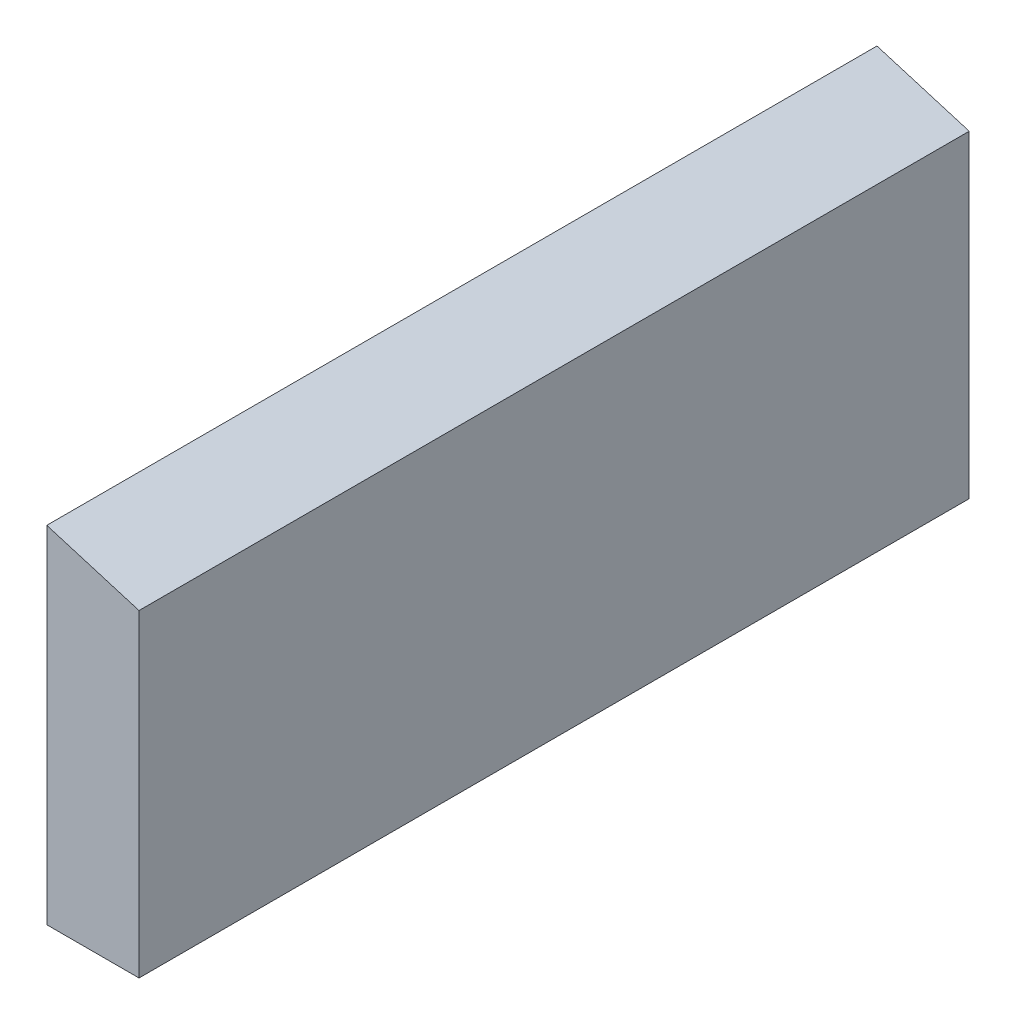
ISO-10303-21;
HEADER;
FILE_DESCRIPTION(('STEP AP214'),'2;1');
FILE_NAME('part.step','',(''),(''),'','','');
FILE_SCHEMA(('AUTOMOTIVE_DESIGN { 1 0 10303 214 1 1 1 1 }'));
ENDSEC;
DATA;
#1=APPLICATION_CONTEXT('core data for automotive mechanical design processes');
#2=APPLICATION_PROTOCOL_DEFINITION('international standard','automotive_design',2000,#1);
#3=PRODUCT_CONTEXT('',#1,'mechanical');
#4=PRODUCT('Part','Part','',(#3));
#5=PRODUCT_RELATED_PRODUCT_CATEGORY('part','',(#4));
#6=PRODUCT_DEFINITION_FORMATION('','',#4);
#7=PRODUCT_DEFINITION_CONTEXT('part definition',#1,'design');
#8=PRODUCT_DEFINITION('design','',#6,#7);
#9=PRODUCT_DEFINITION_SHAPE('','',#8);
#10=(LENGTH_UNIT() NAMED_UNIT(*) SI_UNIT(.MILLI.,.METRE.));
#11=(NAMED_UNIT(*) PLANE_ANGLE_UNIT() SI_UNIT($,.RADIAN.));
#12=(NAMED_UNIT(*) SI_UNIT($,.STERADIAN.) SOLID_ANGLE_UNIT());
#13=UNCERTAINTY_MEASURE_WITH_UNIT(LENGTH_MEASURE(1.E-05),#10,'distance_accuracy_value','');
#14=(GEOMETRIC_REPRESENTATION_CONTEXT(3) GLOBAL_UNCERTAINTY_ASSIGNED_CONTEXT((#13)) GLOBAL_UNIT_ASSIGNED_CONTEXT((#10,
#11,#12)) REPRESENTATION_CONTEXT('',''));
#15=CARTESIAN_POINT('',(0.,0.,0.));
#16=DIRECTION('',(0.,0.,1.));
#17=DIRECTION('',(1.,0.,0.));
#18=AXIS2_PLACEMENT_3D('',#15,#16,#17);
#19=CARTESIAN_POINT('',(0.,69.,180.));
#20=DIRECTION('',(-1.,0.,0.));
#21=DIRECTION('',(0.,-1.,0.));
#22=AXIS2_PLACEMENT_3D('',#19,#20,#21);
#23=PLANE('',#22);
#24=DIRECTION('',(0.,1.,0.));
#25=VECTOR('',#24,1.);
#26=CARTESIAN_POINT('',(0.,69.,0.));
#27=LINE('',#26,#25);
#28=CARTESIAN_POINT('',(0.,0.,0.));
#29=VERTEX_POINT('',#28);
#30=CARTESIAN_POINT('',(0.,69.,0.));
#31=VERTEX_POINT('',#30);
#32=EDGE_CURVE('E109',#29,#31,#27,.T.);
#33=ORIENTED_EDGE('',*,*,#32,.T.);
#34=DIRECTION('',(0.,0.,-1.));
#35=VECTOR('',#34,1.);
#36=CARTESIAN_POINT('',(0.,69.,180.));
#37=LINE('',#36,#35);
#38=CARTESIAN_POINT('',(0.,69.,180.));
#39=VERTEX_POINT('',#38);
#40=EDGE_CURVE('E11',#39,#31,#37,.T.);
#41=ORIENTED_EDGE('',*,*,#40,.F.);
#42=DIRECTION('',(0.,1.,0.));
#43=VECTOR('',#42,1.);
#44=CARTESIAN_POINT('',(0.,69.,180.));
#45=LINE('',#44,#43);
#46=CARTESIAN_POINT('',(0.,0.,180.));
#47=VERTEX_POINT('',#46);
#48=EDGE_CURVE('E92',#47,#39,#45,.T.);
#49=ORIENTED_EDGE('',*,*,#48,.F.);
#50=DIRECTION('',(0.,0.,-1.));
#51=VECTOR('',#50,1.);
#52=CARTESIAN_POINT('',(0.,0.,180.));
#53=LINE('',#52,#51);
#54=EDGE_CURVE('E105',#47,#29,#53,.T.);
#55=ORIENTED_EDGE('',*,*,#54,.T.);
#56=EDGE_LOOP('',(#33,#41,#49,#55));
#57=FACE_BOUND('',#56,.T.);
#58=ADVANCED_FACE('F40',(#57),#23,.F.);
#59=CARTESIAN_POINT('',(-20.,75.,180.));
#60=DIRECTION('',(-0.287347885566345,-0.957826285221152,0.));
#61=DIRECTION('',(0.957826285221152,-0.287347885566345,0.));
#62=AXIS2_PLACEMENT_3D('',#59,#60,#61);
#63=PLANE('',#62);
#64=DIRECTION('',(-0.957826285221151,0.287347885566345,0.));
#65=VECTOR('',#64,1.);
#66=CARTESIAN_POINT('',(-20.,75.,0.));
#67=LINE('',#66,#65);
#68=CARTESIAN_POINT('',(-20.,75.,0.));
#69=VERTEX_POINT('',#68);
#70=EDGE_CURVE('E97',#31,#69,#67,.T.);
#71=ORIENTED_EDGE('',*,*,#70,.T.);
#72=DIRECTION('',(0.,0.,-1.));
#73=VECTOR('',#72,1.);
#74=CARTESIAN_POINT('',(-20.,75.,180.));
#75=LINE('',#74,#73);
#76=CARTESIAN_POINT('',(-20.,75.,180.));
#77=VERTEX_POINT('',#76);
#78=EDGE_CURVE('E49',#77,#69,#75,.T.);
#79=ORIENTED_EDGE('',*,*,#78,.F.);
#80=DIRECTION('',(-0.957826285221151,0.287347885566345,0.));
#81=VECTOR('',#80,1.);
#82=CARTESIAN_POINT('',(-20.,75.,180.));
#83=LINE('',#82,#81);
#84=EDGE_CURVE('E87',#39,#77,#83,.T.);
#85=ORIENTED_EDGE('',*,*,#84,.F.);
#86=ORIENTED_EDGE('',*,*,#40,.T.);
#87=EDGE_LOOP('',(#71,#79,#85,#86));
#88=FACE_BOUND('',#87,.T.);
#89=ADVANCED_FACE('F96',(#88),#63,.F.);
#90=CARTESIAN_POINT('',(-20.,0.,180.));
#91=DIRECTION('',(1.,0.,0.));
#92=DIRECTION('',(0.,0.,-1.));
#93=AXIS2_PLACEMENT_3D('',#90,#91,#92);
#94=PLANE('',#93);
#95=DIRECTION('',(0.,-1.,0.));
#96=VECTOR('',#95,1.);
#97=CARTESIAN_POINT('',(-20.,0.,0.));
#98=LINE('',#97,#96);
#99=CARTESIAN_POINT('',(-20.,0.,0.));
#100=VERTEX_POINT('',#99);
#101=EDGE_CURVE('E74',#69,#100,#98,.T.);
#102=ORIENTED_EDGE('',*,*,#101,.T.);
#103=DIRECTION('',(0.,0.,-1.));
#104=VECTOR('',#103,1.);
#105=CARTESIAN_POINT('',(-20.,0.,180.));
#106=LINE('',#105,#104);
#107=CARTESIAN_POINT('',(-20.,0.,180.));
#108=VERTEX_POINT('',#107);
#109=EDGE_CURVE('E99',#108,#100,#106,.T.);
#110=ORIENTED_EDGE('',*,*,#109,.F.);
#111=DIRECTION('',(0.,-1.,0.));
#112=VECTOR('',#111,1.);
#113=CARTESIAN_POINT('',(-20.,0.,180.));
#114=LINE('',#113,#112);
#115=EDGE_CURVE('E90',#77,#108,#114,.T.);
#116=ORIENTED_EDGE('',*,*,#115,.F.);
#117=ORIENTED_EDGE('',*,*,#78,.T.);
#118=EDGE_LOOP('',(#102,#110,#116,#117));
#119=FACE_BOUND('',#118,.T.);
#120=ADVANCED_FACE('F100',(#119),#94,.F.);
#121=CARTESIAN_POINT('',(0.,0.,180.));
#122=DIRECTION('',(0.,1.,0.));
#123=DIRECTION('',(0.,0.,1.));
#124=AXIS2_PLACEMENT_3D('',#121,#122,#123);
#125=PLANE('',#124);
#126=DIRECTION('',(1.,0.,0.));
#127=VECTOR('',#126,1.);
#128=CARTESIAN_POINT('',(0.,0.,0.));
#129=LINE('',#128,#127);
#130=EDGE_CURVE('E80',#100,#29,#129,.T.);
#131=ORIENTED_EDGE('',*,*,#130,.T.);
#132=ORIENTED_EDGE('',*,*,#54,.F.);
#133=DIRECTION('',(1.,0.,0.));
#134=VECTOR('',#133,1.);
#135=CARTESIAN_POINT('',(0.,0.,180.));
#136=LINE('',#135,#134);
#137=EDGE_CURVE('E57',#108,#47,#136,.T.);
#138=ORIENTED_EDGE('',*,*,#137,.F.);
#139=ORIENTED_EDGE('',*,*,#109,.T.);
#140=EDGE_LOOP('',(#131,#132,#138,#139));
#141=FACE_BOUND('',#140,.T.);
#142=ADVANCED_FACE('F123',(#141),#125,.F.);
#143=CARTESIAN_POINT('',(0.,0.,180.));
#144=DIRECTION('',(0.,0.,-1.));
#145=DIRECTION('',(-1.,0.,0.));
#146=AXIS2_PLACEMENT_3D('',#143,#144,#145);
#147=PLANE('',#146);
#148=ORIENTED_EDGE('',*,*,#48,.T.);
#149=ORIENTED_EDGE('',*,*,#84,.T.);
#150=ORIENTED_EDGE('',*,*,#115,.T.);
#151=ORIENTED_EDGE('',*,*,#137,.T.);
#152=EDGE_LOOP('',(#148,#149,#150,#151));
#153=FACE_BOUND('',#152,.T.);
#154=ADVANCED_FACE('F88',(#153),#147,.F.);
#155=CARTESIAN_POINT('',(0.,0.,0.));
#156=DIRECTION('',(0.,0.,-1.));
#157=DIRECTION('',(-1.,0.,0.));
#158=AXIS2_PLACEMENT_3D('',#155,#156,#157);
#159=PLANE('',#158);
#160=ORIENTED_EDGE('',*,*,#32,.F.);
#161=ORIENTED_EDGE('',*,*,#130,.F.);
#162=ORIENTED_EDGE('',*,*,#101,.F.);
#163=ORIENTED_EDGE('',*,*,#70,.F.);
#164=EDGE_LOOP('',(#160,#161,#162,#163));
#165=FACE_BOUND('',#164,.T.);
#166=ADVANCED_FACE('F126',(#165),#159,.T.);
#167=CLOSED_SHELL('',(#58,#89,#120,#142,#154,#166));
#168=MANIFOLD_SOLID_BREP('B2',#167);
#169=ADVANCED_BREP_SHAPE_REPRESENTATION('',(#18,#168),#14);
#170=SHAPE_DEFINITION_REPRESENTATION(#9,#169);
ENDSEC;
END-ISO-10303-21;
